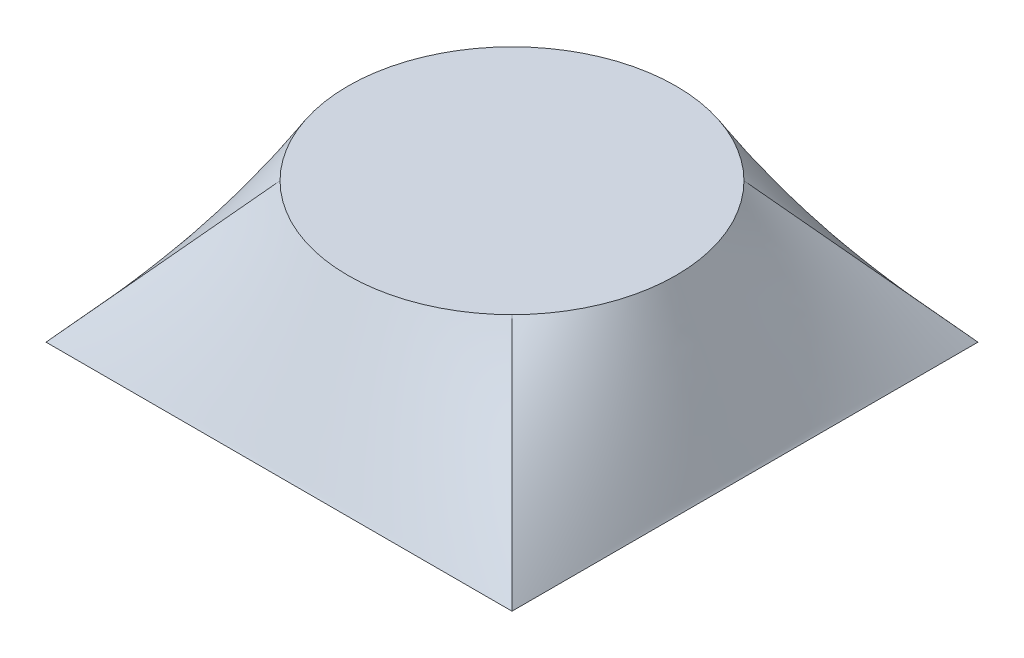
ISO-10303-21;
HEADER;
FILE_DESCRIPTION(('STEP AP214'),'2;1');
FILE_NAME('part.step','',(''),(''),'','','');
FILE_SCHEMA(('AUTOMOTIVE_DESIGN { 1 0 10303 214 1 1 1 1 }'));
ENDSEC;
DATA;
#1=APPLICATION_CONTEXT('core data for automotive mechanical design processes');
#2=APPLICATION_PROTOCOL_DEFINITION('international standard','automotive_design',2000,#1);
#3=PRODUCT_CONTEXT('',#1,'mechanical');
#4=PRODUCT('Part','Part','',(#3));
#5=PRODUCT_RELATED_PRODUCT_CATEGORY('part','',(#4));
#6=PRODUCT_DEFINITION_FORMATION('','',#4);
#7=PRODUCT_DEFINITION_CONTEXT('part definition',#1,'design');
#8=PRODUCT_DEFINITION('design','',#6,#7);
#9=PRODUCT_DEFINITION_SHAPE('','',#8);
#10=(LENGTH_UNIT() NAMED_UNIT(*) SI_UNIT(.MILLI.,.METRE.));
#11=(NAMED_UNIT(*) PLANE_ANGLE_UNIT() SI_UNIT($,.RADIAN.));
#12=(NAMED_UNIT(*) SI_UNIT($,.STERADIAN.) SOLID_ANGLE_UNIT());
#13=UNCERTAINTY_MEASURE_WITH_UNIT(LENGTH_MEASURE(1.E-05),#10,'distance_accuracy_value','');
#14=(GEOMETRIC_REPRESENTATION_CONTEXT(3) GLOBAL_UNCERTAINTY_ASSIGNED_CONTEXT((#13)) GLOBAL_UNIT_ASSIGNED_CONTEXT((#10,
#11,#12)) REPRESENTATION_CONTEXT('',''));
#15=CARTESIAN_POINT('',(0.,0.,0.));
#16=DIRECTION('',(0.,0.,1.));
#17=DIRECTION('',(1.,0.,0.));
#18=AXIS2_PLACEMENT_3D('',#15,#16,#17);
#19=CARTESIAN_POINT('',(0.,12.,0.));
#20=DIRECTION('',(0.,1.,0.));
#21=DIRECTION('',(0.,0.,1.));
#22=AXIS2_PLACEMENT_3D('',#19,#20,#21);
#23=PLANE('',#22);
#24=CARTESIAN_POINT('',(0.,12.,0.));
#25=DIRECTION('',(0.,1.,0.));
#26=DIRECTION('',(0.,0.,1.));
#27=AXIS2_PLACEMENT_3D('',#24,#25,#26);
#28=CIRCLE('',#27,14.0799725024918);
#29=CARTESIAN_POINT('',(9.95604403543211,12.,9.9560440354321));
#30=VERTEX_POINT('',#29);
#31=CARTESIAN_POINT('',(9.9560440354321,12.,-9.95604403543211));
#32=VERTEX_POINT('',#31);
#33=EDGE_CURVE('E12',#30,#32,#28,.T.);
#34=ORIENTED_EDGE('',*,*,#33,.T.);
#35=CARTESIAN_POINT('',(-9.9560440354321,12.,-9.95604403543211));
#36=VERTEX_POINT('',#35);
#37=EDGE_CURVE('E72',#32,#36,#28,.T.);
#38=ORIENTED_EDGE('',*,*,#37,.T.);
#39=CARTESIAN_POINT('',(-9.95604403543211,12.,9.9560440354321));
#40=VERTEX_POINT('',#39);
#41=EDGE_CURVE('E138',#36,#40,#28,.T.);
#42=ORIENTED_EDGE('',*,*,#41,.T.);
#43=EDGE_CURVE('E136',#40,#30,#28,.T.);
#44=ORIENTED_EDGE('',*,*,#43,.T.);
#45=EDGE_LOOP('',(#34,#38,#42,#44));
#46=FACE_BOUND('',#45,.T.);
#47=ADVANCED_FACE('F62',(#46),#23,.T.);
#48=CARTESIAN_POINT('',(0.,0.,0.));
#49=DIRECTION('',(0.,-1.,0.));
#50=DIRECTION('',(0.,0.,-1.));
#51=AXIS2_PLACEMENT_3D('',#48,#49,#50);
#52=PLANE('',#51);
#53=DIRECTION('',(0.,0.,1.));
#54=VECTOR('',#53,1.);
#55=CARTESIAN_POINT('',(-20.,0.,-20.));
#56=LINE('',#55,#54);
#57=CARTESIAN_POINT('',(-20.,0.,-20.));
#58=VERTEX_POINT('',#57);
#59=CARTESIAN_POINT('',(-20.,0.,20.));
#60=VERTEX_POINT('',#59);
#61=EDGE_CURVE('E130',#58,#60,#56,.T.);
#62=ORIENTED_EDGE('',*,*,#61,.F.);
#63=DIRECTION('',(-1.,0.,0.));
#64=VECTOR('',#63,1.);
#65=CARTESIAN_POINT('',(20.,0.,-20.));
#66=LINE('',#65,#64);
#67=CARTESIAN_POINT('',(20.,0.,-20.));
#68=VERTEX_POINT('',#67);
#69=EDGE_CURVE('E112',#68,#58,#66,.T.);
#70=ORIENTED_EDGE('',*,*,#69,.F.);
#71=DIRECTION('',(0.,0.,-1.));
#72=VECTOR('',#71,1.);
#73=CARTESIAN_POINT('',(20.,0.,-20.));
#74=LINE('',#73,#72);
#75=CARTESIAN_POINT('',(20.,0.,20.));
#76=VERTEX_POINT('',#75);
#77=EDGE_CURVE('E103',#76,#68,#74,.T.);
#78=ORIENTED_EDGE('',*,*,#77,.F.);
#79=DIRECTION('',(1.,0.,0.));
#80=VECTOR('',#79,1.);
#81=CARTESIAN_POINT('',(20.,0.,20.));
#82=LINE('',#81,#80);
#83=EDGE_CURVE('E108',#60,#76,#82,.T.);
#84=ORIENTED_EDGE('',*,*,#83,.F.);
#85=EDGE_LOOP('',(#62,#70,#78,#84));
#86=FACE_BOUND('',#85,.T.);
#87=ADVANCED_FACE('F107',(#86),#52,.T.);
#88=CARTESIAN_POINT('',(20.,0.,-20.));
#89=CARTESIAN_POINT('',(9.9560440354321,12.,-9.95604403543211));
#90=CARTESIAN_POINT('',(18.3333333333333,0.,-20.));
#91=CARTESIAN_POINT('',(9.36937851449494,12.,-10.5427095563693));
#92=CARTESIAN_POINT('',(16.6666666666667,0.,-20.));
#93=CARTESIAN_POINT('',(8.70862056151793,12.,-11.0991610771495));
#94=CARTESIAN_POINT('',(13.3333333333333,0.,-20.));
#95=CARTESIAN_POINT('',(7.24777820967257,12.,-12.1037663445888));
#96=CARTESIAN_POINT('',(11.6666666666667,0.,-20.));
#97=CARTESIAN_POINT('',(6.44761920921034,12.,-12.5515948257762));
#98=CARTESIAN_POINT('',(8.33333333333333,0.,-20.));
#99=CARTESIAN_POINT('',(4.73687305358877,12.,-13.2919659874533));
#100=CARTESIAN_POINT('',(6.66666666666666,0.,-20.));
#101=CARTESIAN_POINT('',(3.82641983420658,12.,-13.5841457768199));
#102=CARTESIAN_POINT('',(3.33333333333333,0.,-20.));
#103=CARTESIAN_POINT('',(1.94381969745637,12.,-13.9782713601248));
#104=CARTESIAN_POINT('',(1.66666666666667,0.,-20.));
#105=CARTESIAN_POINT('',(0.972019261395392,12.,-14.0799725024918));
#106=CARTESIAN_POINT('',(-1.66666666666667,0.,-20.));
#107=CARTESIAN_POINT('',(-0.972019261395398,12.,-14.0799725024919));
#108=CARTESIAN_POINT('',(-3.33333333333333,0.,-20.));
#109=CARTESIAN_POINT('',(-1.94381969745637,12.,-13.9782713601247));
#110=CARTESIAN_POINT('',(-6.66666666666667,0.,-20.));
#111=CARTESIAN_POINT('',(-3.82641983420658,12.,-13.5841457768199));
#112=CARTESIAN_POINT('',(-8.33333333333333,0.,-20.));
#113=CARTESIAN_POINT('',(-4.73687305358878,12.,-13.2919659874533));
#114=CARTESIAN_POINT('',(-11.6666666666667,0.,-20.));
#115=CARTESIAN_POINT('',(-6.44761920921035,12.,-12.5515948257762));
#116=CARTESIAN_POINT('',(-13.3333333333333,0.,-20.));
#117=CARTESIAN_POINT('',(-7.24777820967257,12.,-12.1037663445888));
#118=CARTESIAN_POINT('',(-16.6666666666667,0.,-20.));
#119=CARTESIAN_POINT('',(-8.70862056151793,12.,-11.0991610771495));
#120=CARTESIAN_POINT('',(-18.3333333333333,0.,-20.));
#121=CARTESIAN_POINT('',(-9.36937851449495,12.,-10.5427095563693));
#122=CARTESIAN_POINT('',(-20.,0.,-20.));
#123=CARTESIAN_POINT('',(-9.9560440354321,12.,-9.95604403543211));
#124=B_SPLINE_SURFACE_WITH_KNOTS('',3,1,((#88,#89),(#90,#91),(#92,#93),(#94,#95),(#96,#97),(#98,
#99),(#100,#101),(#102,#103),(#104,#105),(#106,#107),(#108,#109),(#110,#111),(#112,#113),(#114,
#115),(#116,#117),(#118,#119),(#120,#121),(#122,#123)),.UNSPECIFIED.,.F.,.F.,.F.,(4,2,2,2,2,2,2,
2,4),(2,2),(0.,0.125,0.25,0.375,0.5,0.625,0.75,0.875,1.),(0.,1.),.UNSPECIFIED.);
#125=DIRECTION('',(0.540152144395532,0.64534589315329,0.540152144395531));
#126=VECTOR('',#125,1.);
#127=CARTESIAN_POINT('',(-14.9780220177161,6.,-14.9780220177161));
#128=LINE('',#127,#126);
#129=EDGE_CURVE('E140',#58,#36,#128,.T.);
#130=DIRECTION('',(0.540152144395532,-0.64534589315329,-0.540152144395532));
#131=VECTOR('',#130,1.);
#132=CARTESIAN_POINT('',(14.978022017716,6.,-14.9780220177161));
#133=LINE('',#132,#131);
#134=EDGE_CURVE('E235',#32,#68,#133,.T.);
#135=ORIENTED_EDGE('',*,*,#69,.T.);
#136=ORIENTED_EDGE('',*,*,#129,.T.);
#137=ORIENTED_EDGE('',*,*,#37,.F.);
#138=ORIENTED_EDGE('',*,*,#134,.T.);
#139=EDGE_LOOP('',(#135,#136,#137,#138));
#140=FACE_BOUND('',#139,.T.);
#141=ADVANCED_FACE('F242',(#140),#124,.T.);
#142=CARTESIAN_POINT('',(-20.,0.,-20.));
#143=CARTESIAN_POINT('',(-9.9560440354321,12.,-9.95604403543211));
#144=CARTESIAN_POINT('',(-20.,0.,-18.3333333333333));
#145=CARTESIAN_POINT('',(-10.5427095563693,12.,-9.36937851449495));
#146=CARTESIAN_POINT('',(-20.,0.,-16.6666666666667));
#147=CARTESIAN_POINT('',(-11.0991610771495,12.,-8.70862056151793));
#148=CARTESIAN_POINT('',(-20.,0.,-13.3333333333333));
#149=CARTESIAN_POINT('',(-12.1037663445888,12.,-7.24777820967257));
#150=CARTESIAN_POINT('',(-20.,0.,-11.6666666666667));
#151=CARTESIAN_POINT('',(-12.5515948257762,12.,-6.44761920921035));
#152=CARTESIAN_POINT('',(-20.,0.,-8.33333333333334));
#153=CARTESIAN_POINT('',(-13.2919659874533,12.,-4.73687305358878));
#154=CARTESIAN_POINT('',(-20.,0.,-6.66666666666667));
#155=CARTESIAN_POINT('',(-13.5841457768199,12.,-3.82641983420659));
#156=CARTESIAN_POINT('',(-20.,0.,-3.33333333333334));
#157=CARTESIAN_POINT('',(-13.9782713601247,12.,-1.94381969745637));
#158=CARTESIAN_POINT('',(-20.,0.,-1.66666666666667));
#159=CARTESIAN_POINT('',(-14.0799725024918,12.,-0.972019261395398));
#160=CARTESIAN_POINT('',(-20.,0.,1.66666666666666));
#161=CARTESIAN_POINT('',(-14.0799725024918,12.,0.972019261395391));
#162=CARTESIAN_POINT('',(-20.,0.,3.33333333333333));
#163=CARTESIAN_POINT('',(-13.9782713601248,12.,1.94381969745637));
#164=CARTESIAN_POINT('',(-20.,0.,6.66666666666666));
#165=CARTESIAN_POINT('',(-13.5841457768199,12.,3.82641983420658));
#166=CARTESIAN_POINT('',(-20.,0.,8.33333333333333));
#167=CARTESIAN_POINT('',(-13.2919659874533,12.,4.73687305358877));
#168=CARTESIAN_POINT('',(-20.,0.,11.6666666666667));
#169=CARTESIAN_POINT('',(-12.5515948257762,12.,6.44761920921035));
#170=CARTESIAN_POINT('',(-20.,0.,13.3333333333333));
#171=CARTESIAN_POINT('',(-12.1037663445888,12.,7.24777820967257));
#172=CARTESIAN_POINT('',(-20.,0.,16.6666666666667));
#173=CARTESIAN_POINT('',(-11.0991610771495,12.,8.70862056151793));
#174=CARTESIAN_POINT('',(-20.,0.,18.3333333333333));
#175=CARTESIAN_POINT('',(-10.5427095563693,12.,9.36937851449494));
#176=CARTESIAN_POINT('',(-20.,0.,20.));
#177=CARTESIAN_POINT('',(-9.95604403543211,12.,9.9560440354321));
#178=B_SPLINE_SURFACE_WITH_KNOTS('',3,1,((#142,#143),(#144,#145),(#146,#147),(#148,#149),(#150,
#151),(#152,#153),(#154,#155),(#156,#157),(#158,#159),(#160,#161),(#162,#163),(#164,#165),(#166,
#167),(#168,#169),(#170,#171),(#172,#173),(#174,#175),(#176,#177)),.UNSPECIFIED.,.F.,.F.,.F.,(4,
2,2,2,2,2,2,2,4),(2,2),(0.,0.125,0.25,0.375,0.5,0.625,0.75,0.875,1.),(0.,1.),.UNSPECIFIED.);
#179=DIRECTION('',(0.540152144395531,0.64534589315329,-0.540152144395532));
#180=VECTOR('',#179,1.);
#181=CARTESIAN_POINT('',(-14.9780220177161,6.,14.9780220177161));
#182=LINE('',#181,#180);
#183=EDGE_CURVE('E129',#60,#40,#182,.T.);
#184=ORIENTED_EDGE('',*,*,#61,.T.);
#185=ORIENTED_EDGE('',*,*,#183,.T.);
#186=ORIENTED_EDGE('',*,*,#41,.F.);
#187=ORIENTED_EDGE('',*,*,#129,.F.);
#188=EDGE_LOOP('',(#184,#185,#186,#187));
#189=FACE_BOUND('',#188,.T.);
#190=ADVANCED_FACE('F162',(#189),#178,.T.);
#191=CARTESIAN_POINT('',(20.,0.,20.));
#192=CARTESIAN_POINT('',(9.95604403543211,12.,9.9560440354321));
#193=CARTESIAN_POINT('',(20.,0.,18.3333333333333));
#194=CARTESIAN_POINT('',(10.5427095563693,12.,9.36937851449494));
#195=CARTESIAN_POINT('',(20.,0.,16.6666666666667));
#196=CARTESIAN_POINT('',(11.0991610771495,12.,8.70862056151793));
#197=CARTESIAN_POINT('',(20.,0.,13.3333333333334));
#198=CARTESIAN_POINT('',(12.1037663445888,12.,7.24777820967257));
#199=CARTESIAN_POINT('',(20.,0.,11.6666666666667));
#200=CARTESIAN_POINT('',(12.5515948257762,12.,6.44761920921035));
#201=CARTESIAN_POINT('',(20.,0.,8.33333333333342));
#202=CARTESIAN_POINT('',(13.2919659874533,12.,4.73687305358878));
#203=CARTESIAN_POINT('',(20.,0.,6.66666666666677));
#204=CARTESIAN_POINT('',(13.5841457768199,12.,3.82641983420658));
#205=CARTESIAN_POINT('',(20.,0.,3.33333333333344));
#206=CARTESIAN_POINT('',(13.9782713601247,12.,1.94381969745637));
#207=CARTESIAN_POINT('',(20.,0.,1.66666666666678));
#208=CARTESIAN_POINT('',(14.0799725024918,12.,0.97201926139539));
#209=CARTESIAN_POINT('',(20.,0.,-1.66666666666655));
#210=CARTESIAN_POINT('',(14.0799725024918,12.,-0.972019261395399));
#211=CARTESIAN_POINT('',(20.,0.,-3.33333333333322));
#212=CARTESIAN_POINT('',(13.9782713601247,12.,-1.94381969745637));
#213=CARTESIAN_POINT('',(20.,0.,-6.66666666666657));
#214=CARTESIAN_POINT('',(13.5841457768199,12.,-3.82641983420659));
#215=CARTESIAN_POINT('',(20.,0.,-8.33333333333324));
#216=CARTESIAN_POINT('',(13.2919659874533,12.,-4.73687305358878));
#217=CARTESIAN_POINT('',(20.,0.,-11.6666666666666));
#218=CARTESIAN_POINT('',(12.5515948257762,12.,-6.44761920921035));
#219=CARTESIAN_POINT('',(20.,0.,-13.3333333333333));
#220=CARTESIAN_POINT('',(12.1037663445888,12.,-7.24777820967258));
#221=CARTESIAN_POINT('',(20.,0.,-16.6666666666666));
#222=CARTESIAN_POINT('',(11.0991610771495,12.,-8.70862056151793));
#223=CARTESIAN_POINT('',(20.,0.,-18.3333333333333));
#224=CARTESIAN_POINT('',(10.5427095563693,12.,-9.36937851449495));
#225=CARTESIAN_POINT('',(20.,0.,-20.));
#226=CARTESIAN_POINT('',(9.9560440354321,12.,-9.95604403543211));
#227=B_SPLINE_SURFACE_WITH_KNOTS('',3,1,((#191,#192),(#193,#194),(#195,#196),(#197,#198),(#199,
#200),(#201,#202),(#203,#204),(#205,#206),(#207,#208),(#209,#210),(#211,#212),(#213,#214),(#215,
#216),(#217,#218),(#219,#220),(#221,#222),(#223,#224),(#225,#226)),.UNSPECIFIED.,.F.,.F.,.F.,(4,
2,2,2,2,2,2,2,4),(2,2),(0.,0.125,0.25,0.375,0.5,0.625,0.75,0.875,1.),(0.,1.),.UNSPECIFIED.);
#228=DIRECTION('',(-0.540152144395532,0.64534589315329,-0.540152144395532));
#229=VECTOR('',#228,1.);
#230=CARTESIAN_POINT('',(14.9780220177161,6.,14.9780220177161));
#231=LINE('',#230,#229);
#232=EDGE_CURVE('E127',#76,#30,#231,.T.);
#233=ORIENTED_EDGE('',*,*,#77,.T.);
#234=ORIENTED_EDGE('',*,*,#134,.F.);
#235=ORIENTED_EDGE('',*,*,#33,.F.);
#236=ORIENTED_EDGE('',*,*,#232,.F.);
#237=EDGE_LOOP('',(#233,#234,#235,#236));
#238=FACE_BOUND('',#237,.T.);
#239=ADVANCED_FACE('F134',(#238),#227,.T.);
#240=CARTESIAN_POINT('',(-20.,0.,20.));
#241=CARTESIAN_POINT('',(-9.95604403543211,12.,9.9560440354321));
#242=CARTESIAN_POINT('',(-18.3333333333333,0.,20.));
#243=CARTESIAN_POINT('',(-9.36937851449495,12.,10.5427095563693));
#244=CARTESIAN_POINT('',(-16.6666666666667,0.,20.));
#245=CARTESIAN_POINT('',(-8.70862056151793,12.,11.0991610771495));
#246=CARTESIAN_POINT('',(-13.3333333333333,0.,20.));
#247=CARTESIAN_POINT('',(-7.24777820967257,12.,12.1037663445888));
#248=CARTESIAN_POINT('',(-11.6666666666667,0.,20.));
#249=CARTESIAN_POINT('',(-6.44761920921035,12.,12.5515948257762));
#250=CARTESIAN_POINT('',(-8.33333333333333,0.,20.));
#251=CARTESIAN_POINT('',(-4.73687305358878,12.,13.2919659874533));
#252=CARTESIAN_POINT('',(-6.66666666666666,0.,20.));
#253=CARTESIAN_POINT('',(-3.82641983420659,12.,13.5841457768199));
#254=CARTESIAN_POINT('',(-3.33333333333333,0.,20.));
#255=CARTESIAN_POINT('',(-1.94381969745637,12.,13.9782713601247));
#256=CARTESIAN_POINT('',(-1.66666666666666,0.,20.));
#257=CARTESIAN_POINT('',(-0.972019261395396,12.,14.0799725024918));
#258=CARTESIAN_POINT('',(1.66666666666667,0.,20.));
#259=CARTESIAN_POINT('',(0.972019261395393,12.,14.0799725024918));
#260=CARTESIAN_POINT('',(3.33333333333334,0.,20.));
#261=CARTESIAN_POINT('',(1.94381969745637,12.,13.9782713601247));
#262=CARTESIAN_POINT('',(6.66666666666667,0.,20.));
#263=CARTESIAN_POINT('',(3.82641983420658,12.,13.5841457768199));
#264=CARTESIAN_POINT('',(8.33333333333334,0.,20.));
#265=CARTESIAN_POINT('',(4.73687305358878,12.,13.2919659874533));
#266=CARTESIAN_POINT('',(11.6666666666667,0.,20.));
#267=CARTESIAN_POINT('',(6.44761920921035,12.,12.5515948257762));
#268=CARTESIAN_POINT('',(13.3333333333333,0.,20.));
#269=CARTESIAN_POINT('',(7.24777820967257,12.,12.1037663445888));
#270=CARTESIAN_POINT('',(16.6666666666667,0.,20.));
#271=CARTESIAN_POINT('',(8.70862056151793,12.,11.0991610771495));
#272=CARTESIAN_POINT('',(18.3333333333333,0.,20.));
#273=CARTESIAN_POINT('',(9.36937851449495,12.,10.5427095563693));
#274=CARTESIAN_POINT('',(20.,0.,20.));
#275=CARTESIAN_POINT('',(9.95604403543211,12.,9.9560440354321));
#276=B_SPLINE_SURFACE_WITH_KNOTS('',3,1,((#240,#241),(#242,#243),(#244,#245),(#246,#247),(#248,
#249),(#250,#251),(#252,#253),(#254,#255),(#256,#257),(#258,#259),(#260,#261),(#262,#263),(#264,
#265),(#266,#267),(#268,#269),(#270,#271),(#272,#273),(#274,#275)),.UNSPECIFIED.,.F.,.F.,.F.,(4,
2,2,2,2,2,2,2,4),(2,2),(0.,0.125,0.25,0.375,0.5,0.625,0.75,0.875,1.),(0.,1.),.UNSPECIFIED.);
#277=ORIENTED_EDGE('',*,*,#83,.T.);
#278=ORIENTED_EDGE('',*,*,#232,.T.);
#279=ORIENTED_EDGE('',*,*,#43,.F.);
#280=ORIENTED_EDGE('',*,*,#183,.F.);
#281=EDGE_LOOP('',(#277,#278,#279,#280));
#282=FACE_BOUND('',#281,.T.);
#283=ADVANCED_FACE('F125',(#282),#276,.T.);
#284=CLOSED_SHELL('',(#47,#87,#141,#190,#239,#283));
#285=MANIFOLD_SOLID_BREP('B2',#284);
#286=ADVANCED_BREP_SHAPE_REPRESENTATION('',(#18,#285),#14);
#287=SHAPE_DEFINITION_REPRESENTATION(#9,#286);
ENDSEC;
END-ISO-10303-21;
